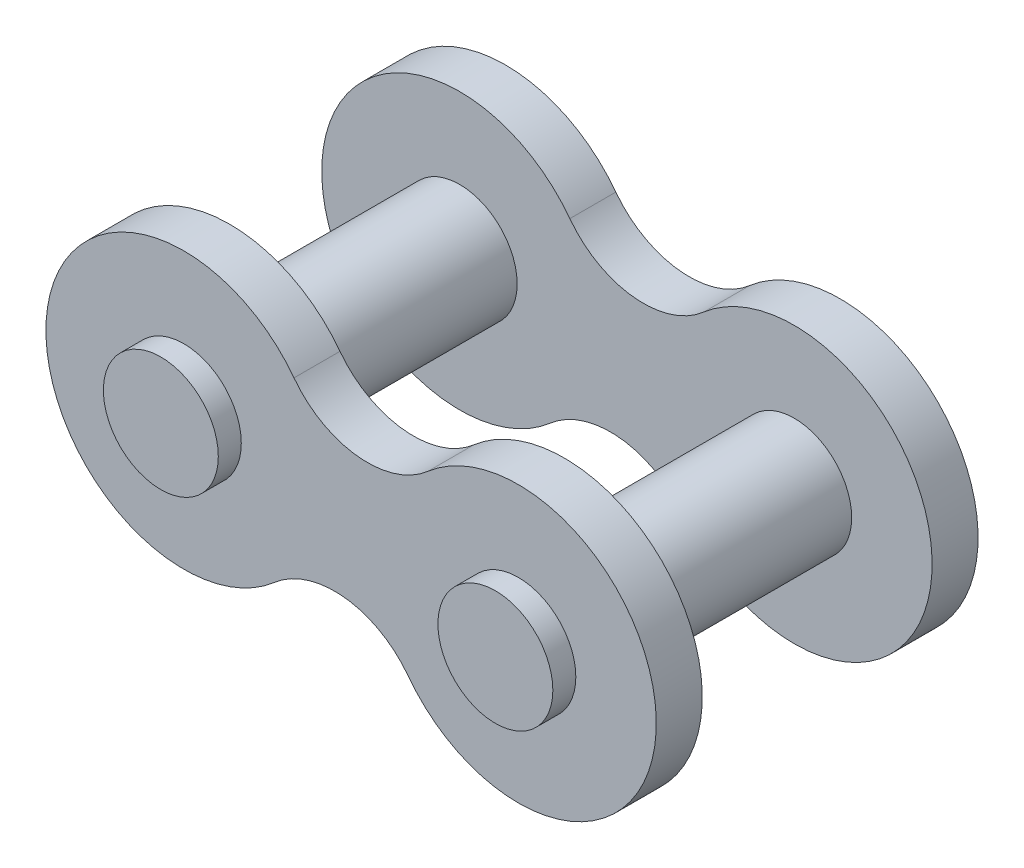
ISO-10303-21;
HEADER;
FILE_DESCRIPTION(('STEP AP214'),'2;1');
FILE_NAME('part.step','',(''),(''),'','','');
FILE_SCHEMA(('AUTOMOTIVE_DESIGN { 1 0 10303 214 1 1 1 1 }'));
ENDSEC;
DATA;
#1=APPLICATION_CONTEXT('core data for automotive mechanical design processes');
#2=APPLICATION_PROTOCOL_DEFINITION('international standard','automotive_design',2000,#1);
#3=PRODUCT_CONTEXT('',#1,'mechanical');
#4=PRODUCT('Part','Part','',(#3));
#5=PRODUCT_RELATED_PRODUCT_CATEGORY('part','',(#4));
#6=PRODUCT_DEFINITION_FORMATION('','',#4);
#7=PRODUCT_DEFINITION_CONTEXT('part definition',#1,'design');
#8=PRODUCT_DEFINITION('design','',#6,#7);
#9=PRODUCT_DEFINITION_SHAPE('','',#8);
#10=(LENGTH_UNIT() NAMED_UNIT(*) SI_UNIT(.MILLI.,.METRE.));
#11=(NAMED_UNIT(*) PLANE_ANGLE_UNIT() SI_UNIT($,.RADIAN.));
#12=(NAMED_UNIT(*) SI_UNIT($,.STERADIAN.) SOLID_ANGLE_UNIT());
#13=UNCERTAINTY_MEASURE_WITH_UNIT(LENGTH_MEASURE(1.E-05),#10,'distance_accuracy_value','');
#14=(GEOMETRIC_REPRESENTATION_CONTEXT(3) GLOBAL_UNCERTAINTY_ASSIGNED_CONTEXT((#13)) GLOBAL_UNIT_ASSIGNED_CONTEXT((#10,
#11,#12)) REPRESENTATION_CONTEXT('',''));
#15=CARTESIAN_POINT('',(0.,0.,0.));
#16=DIRECTION('',(0.,0.,1.));
#17=DIRECTION('',(1.,0.,0.));
#18=AXIS2_PLACEMENT_3D('',#15,#16,#17);
#19=CARTESIAN_POINT('',(14.5538183572432,68.4703320513664,3.));
#20=DIRECTION('',(0.,0.,-1.));
#21=DIRECTION('',(-1.,0.,0.));
#22=AXIS2_PLACEMENT_3D('',#19,#20,#21);
#23=CYLINDRICAL_SURFACE('',#22,2.5);
#24=CARTESIAN_POINT('',(14.5538183572432,68.4703320513664,3.));
#25=DIRECTION('',(0.,0.,1.));
#26=DIRECTION('',(1.,0.,0.));
#27=AXIS2_PLACEMENT_3D('',#24,#25,#26);
#28=CIRCLE('',#27,2.5);
#29=CARTESIAN_POINT('',(17.0538183572432,68.4703320513664,3.));
#30=VERTEX_POINT('',#29);
#31=EDGE_CURVE('E11',#30,#30,#28,.T.);
#32=ORIENTED_EDGE('',*,*,#31,.F.);
#33=EDGE_LOOP('',(#32));
#34=FACE_BOUND('',#33,.T.);
#35=CARTESIAN_POINT('',(14.5538183572432,68.4703320513664,-13.));
#36=DIRECTION('',(0.,0.,1.));
#37=DIRECTION('',(1.,0.,0.));
#38=AXIS2_PLACEMENT_3D('',#35,#36,#37);
#39=CIRCLE('',#38,2.5);
#40=CARTESIAN_POINT('',(17.0538183572432,68.4703320513664,-13.));
#41=VERTEX_POINT('',#40);
#42=EDGE_CURVE('E53',#41,#41,#39,.T.);
#43=ORIENTED_EDGE('',*,*,#42,.T.);
#44=EDGE_LOOP('',(#43));
#45=FACE_BOUND('',#44,.T.);
#46=ADVANCED_FACE('F50',(#34,#45),#23,.T.);
#47=CARTESIAN_POINT('',(0.,0.,3.));
#48=DIRECTION('',(0.,0.,1.));
#49=DIRECTION('',(1.,0.,0.));
#50=AXIS2_PLACEMENT_3D('',#47,#48,#49);
#51=PLANE('',#50);
#52=ORIENTED_EDGE('',*,*,#31,.T.);
#53=EDGE_LOOP('',(#52));
#54=FACE_BOUND('',#53,.T.);
#55=ADVANCED_FACE('F65',(#54),#51,.T.);
#56=CARTESIAN_POINT('',(0.,0.,-13.));
#57=DIRECTION('',(0.,0.,1.));
#58=DIRECTION('',(1.,0.,0.));
#59=AXIS2_PLACEMENT_3D('',#56,#57,#58);
#60=PLANE('',#59);
#61=ORIENTED_EDGE('',*,*,#42,.F.);
#62=EDGE_LOOP('',(#61));
#63=FACE_BOUND('',#62,.T.);
#64=ADVANCED_FACE('F63',(#63),#60,.F.);
#65=CLOSED_SHELL('',(#46,#55,#64));
#66=MANIFOLD_SOLID_BREP('B2',#65);
#67=CARTESIAN_POINT('',(0.,70.,3.));
#68=DIRECTION('',(0.,0.,-1.));
#69=DIRECTION('',(-1.,0.,0.));
#70=AXIS2_PLACEMENT_3D('',#67,#68,#69);
#71=CYLINDRICAL_SURFACE('',#70,2.50000000000001);
#72=CARTESIAN_POINT('',(0.,70.,3.));
#73=DIRECTION('',(0.,0.,1.));
#74=DIRECTION('',(1.,0.,0.));
#75=AXIS2_PLACEMENT_3D('',#72,#73,#74);
#76=CIRCLE('',#75,2.50000000000001);
#77=CARTESIAN_POINT('',(2.50000000000001,70.,3.));
#78=VERTEX_POINT('',#77);
#79=EDGE_CURVE('E49',#78,#78,#76,.T.);
#80=ORIENTED_EDGE('',*,*,#79,.F.);
#81=EDGE_LOOP('',(#80));
#82=FACE_BOUND('',#81,.T.);
#83=CARTESIAN_POINT('',(0.,70.,-13.));
#84=DIRECTION('',(0.,0.,1.));
#85=DIRECTION('',(1.,0.,0.));
#86=AXIS2_PLACEMENT_3D('',#83,#84,#85);
#87=CIRCLE('',#86,2.50000000000001);
#88=CARTESIAN_POINT('',(2.50000000000001,70.,-13.));
#89=VERTEX_POINT('',#88);
#90=EDGE_CURVE('E104',#89,#89,#87,.T.);
#91=ORIENTED_EDGE('',*,*,#90,.T.);
#92=EDGE_LOOP('',(#91));
#93=FACE_BOUND('',#92,.T.);
#94=ADVANCED_FACE('F101',(#82,#93),#71,.T.);
#95=CARTESIAN_POINT('',(0.,0.,3.));
#96=DIRECTION('',(0.,0.,1.));
#97=DIRECTION('',(1.,0.,0.));
#98=AXIS2_PLACEMENT_3D('',#95,#96,#97);
#99=PLANE('',#98);
#100=ORIENTED_EDGE('',*,*,#79,.T.);
#101=EDGE_LOOP('',(#100));
#102=FACE_BOUND('',#101,.T.);
#103=ADVANCED_FACE('F116',(#102),#99,.T.);
#104=CARTESIAN_POINT('',(0.,0.,-13.));
#105=DIRECTION('',(0.,0.,1.));
#106=DIRECTION('',(1.,0.,0.));
#107=AXIS2_PLACEMENT_3D('',#104,#105,#106);
#108=PLANE('',#107);
#109=ORIENTED_EDGE('',*,*,#90,.F.);
#110=EDGE_LOOP('',(#109));
#111=FACE_BOUND('',#110,.T.);
#112=ADVANCED_FACE('F114',(#111),#108,.F.);
#113=CLOSED_SHELL('',(#94,#103,#112));
#114=MANIFOLD_SOLID_BREP('B6',#113);
#115=CARTESIAN_POINT('',(6.56441429790983,62.4562300588235,-12.));
#116=DIRECTION('',(0.,0.,1.));
#117=DIRECTION('',(1.,0.,0.));
#118=AXIS2_PLACEMENT_3D('',#115,#116,#117);
#119=CYLINDRICAL_SURFACE('',#118,4.00000000000003);
#120=CARTESIAN_POINT('',(6.56441429790983,62.4562300588235,-10.));
#121=DIRECTION('',(0.,0.,-1.));
#122=DIRECTION('',(1.,0.,0.));
#123=AXIS2_PLACEMENT_3D('',#120,#121,#122);
#124=CIRCLE('',#123,4.00000000000003);
#125=CARTESIAN_POINT('',(3.93864857874589,65.4737380352941,-10.));
#126=VERTEX_POINT('',#125);
#127=CARTESIAN_POINT('',(9.76017592164318,64.8618708558406,-10.));
#128=VERTEX_POINT('',#127);
#129=EDGE_CURVE('E216',#126,#128,#124,.T.);
#130=ORIENTED_EDGE('',*,*,#129,.F.);
#131=DIRECTION('',(0.,0.,1.));
#132=VECTOR('',#131,1.);
#133=CARTESIAN_POINT('',(3.93864857874589,65.4737380352941,-12.));
#134=LINE('',#133,#132);
#135=CARTESIAN_POINT('',(3.93864857874589,65.4737380352941,-12.));
#136=VERTEX_POINT('',#135);
#137=EDGE_CURVE('E99',#136,#126,#134,.T.);
#138=ORIENTED_EDGE('',*,*,#137,.F.);
#139=CARTESIAN_POINT('',(6.56441429790983,62.4562300588235,-12.));
#140=DIRECTION('',(0.,0.,-1.));
#141=DIRECTION('',(1.,0.,0.));
#142=AXIS2_PLACEMENT_3D('',#139,#140,#141);
#143=CIRCLE('',#142,4.00000000000003);
#144=CARTESIAN_POINT('',(9.76017592164318,64.8618708558406,-12.));
#145=VERTEX_POINT('',#144);
#146=EDGE_CURVE('E209',#136,#145,#143,.T.);
#147=ORIENTED_EDGE('',*,*,#146,.T.);
#148=DIRECTION('',(0.,0.,1.));
#149=VECTOR('',#148,1.);
#150=CARTESIAN_POINT('',(9.76017592164318,64.8618708558406,-12.));
#151=LINE('',#150,#149);
#152=EDGE_CURVE('E154',#145,#128,#151,.T.);
#153=ORIENTED_EDGE('',*,*,#152,.T.);
#154=EDGE_LOOP('',(#130,#138,#147,#153));
#155=FACE_BOUND('',#154,.T.);
#156=ADVANCED_FACE('F151',(#155),#119,.F.);
#157=CARTESIAN_POINT('',(0.,70.,-12.));
#158=DIRECTION('',(0.,0.,1.));
#159=DIRECTION('',(1.,0.,0.));
#160=AXIS2_PLACEMENT_3D('',#157,#158,#159);
#161=CYLINDRICAL_SURFACE('',#160,6.00000000000003);
#162=CARTESIAN_POINT('',(0.,70.,-10.));
#163=DIRECTION('',(0.,0.,1.));
#164=DIRECTION('',(1.,0.,0.));
#165=AXIS2_PLACEMENT_3D('',#162,#163,#164);
#166=CIRCLE('',#165,6.00000000000003);
#167=CARTESIAN_POINT('',(4.79364243560004,73.6084611955257,-10.));
#168=VERTEX_POINT('',#167);
#169=EDGE_CURVE('E211',#168,#126,#166,.T.);
#170=ORIENTED_EDGE('',*,*,#169,.F.);
#171=DIRECTION('',(0.,0.,1.));
#172=VECTOR('',#171,1.);
#173=CARTESIAN_POINT('',(4.79364243560004,73.6084611955257,-12.));
#174=LINE('',#173,#172);
#175=CARTESIAN_POINT('',(4.79364243560004,73.6084611955257,-12.));
#176=VERTEX_POINT('',#175);
#177=EDGE_CURVE('E160',#176,#168,#174,.T.);
#178=ORIENTED_EDGE('',*,*,#177,.F.);
#179=CARTESIAN_POINT('',(0.,70.,-12.));
#180=DIRECTION('',(0.,0.,1.));
#181=DIRECTION('',(1.,0.,0.));
#182=AXIS2_PLACEMENT_3D('',#179,#180,#181);
#183=CIRCLE('',#182,6.00000000000003);
#184=EDGE_CURVE('E206',#176,#136,#183,.T.);
#185=ORIENTED_EDGE('',*,*,#184,.T.);
#186=ORIENTED_EDGE('',*,*,#137,.T.);
#187=EDGE_LOOP('',(#170,#178,#185,#186));
#188=FACE_BOUND('',#187,.T.);
#189=ADVANCED_FACE('F227',(#188),#161,.T.);
#190=CARTESIAN_POINT('',(7.98940405933339,76.0141019925429,-12.));
#191=DIRECTION('',(0.,0.,1.));
#192=DIRECTION('',(1.,0.,0.));
#193=AXIS2_PLACEMENT_3D('',#190,#191,#192);
#194=CYLINDRICAL_SURFACE('',#193,4.00000000000003);
#195=CARTESIAN_POINT('',(7.98940405933339,76.0141019925429,-10.));
#196=DIRECTION('',(0.,0.,-1.));
#197=DIRECTION('',(-1.,0.,0.));
#198=AXIS2_PLACEMENT_3D('',#195,#196,#197);
#199=CIRCLE('',#198,4.00000000000003);
#200=CARTESIAN_POINT('',(10.6151697784973,72.9965940160723,-10.));
#201=VERTEX_POINT('',#200);
#202=EDGE_CURVE('E201',#201,#168,#199,.T.);
#203=ORIENTED_EDGE('',*,*,#202,.F.);
#204=DIRECTION('',(0.,0.,1.));
#205=VECTOR('',#204,1.);
#206=CARTESIAN_POINT('',(10.6151697784973,72.9965940160723,-12.));
#207=LINE('',#206,#205);
#208=CARTESIAN_POINT('',(10.6151697784973,72.9965940160723,-12.));
#209=VERTEX_POINT('',#208);
#210=EDGE_CURVE('E196',#209,#201,#207,.T.);
#211=ORIENTED_EDGE('',*,*,#210,.F.);
#212=CARTESIAN_POINT('',(7.98940405933339,76.0141019925429,-12.));
#213=DIRECTION('',(0.,0.,-1.));
#214=DIRECTION('',(-1.,0.,0.));
#215=AXIS2_PLACEMENT_3D('',#212,#213,#214);
#216=CIRCLE('',#215,4.00000000000003);
#217=EDGE_CURVE('E199',#209,#176,#216,.T.);
#218=ORIENTED_EDGE('',*,*,#217,.T.);
#219=ORIENTED_EDGE('',*,*,#177,.T.);
#220=EDGE_LOOP('',(#203,#211,#218,#219));
#221=FACE_BOUND('',#220,.T.);
#222=ADVANCED_FACE('F198',(#221),#194,.F.);
#223=CARTESIAN_POINT('',(14.5538183572432,68.4703320513664,-12.));
#224=DIRECTION('',(0.,0.,1.));
#225=DIRECTION('',(1.,0.,0.));
#226=AXIS2_PLACEMENT_3D('',#223,#224,#225);
#227=CYLINDRICAL_SURFACE('',#226,6.00000000000004);
#228=CARTESIAN_POINT('',(14.5538183572432,68.4703320513664,-10.));
#229=DIRECTION('',(0.,0.,1.));
#230=DIRECTION('',(1.,0.,0.));
#231=AXIS2_PLACEMENT_3D('',#228,#229,#230);
#232=CIRCLE('',#231,6.00000000000004);
#233=EDGE_CURVE('E219',#128,#201,#232,.T.);
#234=ORIENTED_EDGE('',*,*,#233,.F.);
#235=ORIENTED_EDGE('',*,*,#152,.F.);
#236=CARTESIAN_POINT('',(14.5538183572432,68.4703320513664,-12.));
#237=DIRECTION('',(0.,0.,1.));
#238=DIRECTION('',(1.,0.,0.));
#239=AXIS2_PLACEMENT_3D('',#236,#237,#238);
#240=CIRCLE('',#239,6.00000000000004);
#241=EDGE_CURVE('E205',#145,#209,#240,.T.);
#242=ORIENTED_EDGE('',*,*,#241,.T.);
#243=ORIENTED_EDGE('',*,*,#210,.T.);
#244=EDGE_LOOP('',(#234,#235,#242,#243));
#245=FACE_BOUND('',#244,.T.);
#246=ADVANCED_FACE('F208',(#245),#227,.T.);
#247=CARTESIAN_POINT('',(3.28220714895491,66.2281150294117,-12.));
#248=DIRECTION('',(0.,0.,1.));
#249=DIRECTION('',(1.,0.,0.));
#250=AXIS2_PLACEMENT_3D('',#247,#248,#249);
#251=PLANE('',#250);
#252=CARTESIAN_POINT('',(14.5538183572432,68.4703320513664,-12.));
#253=DIRECTION('',(0.,0.,1.));
#254=DIRECTION('',(1.,0.,0.));
#255=AXIS2_PLACEMENT_3D('',#252,#253,#254);
#256=CIRCLE('',#255,2.5);
#257=CARTESIAN_POINT('',(17.0538183572432,68.4703320513664,-12.));
#258=VERTEX_POINT('',#257);
#259=EDGE_CURVE('E260',#258,#258,#256,.T.);
#260=ORIENTED_EDGE('',*,*,#259,.T.);
#261=EDGE_LOOP('',(#260));
#262=FACE_BOUND('',#261,.T.);
#263=CARTESIAN_POINT('',(0.,70.,-12.));
#264=DIRECTION('',(0.,0.,1.));
#265=DIRECTION('',(1.,0.,0.));
#266=AXIS2_PLACEMENT_3D('',#263,#264,#265);
#267=CIRCLE('',#266,2.50000000000001);
#268=CARTESIAN_POINT('',(2.50000000000001,70.,-12.));
#269=VERTEX_POINT('',#268);
#270=EDGE_CURVE('E220',#269,#269,#267,.T.);
#271=ORIENTED_EDGE('',*,*,#270,.T.);
#272=EDGE_LOOP('',(#271));
#273=FACE_BOUND('',#272,.T.);
#274=ORIENTED_EDGE('',*,*,#146,.F.);
#275=ORIENTED_EDGE('',*,*,#184,.F.);
#276=ORIENTED_EDGE('',*,*,#217,.F.);
#277=ORIENTED_EDGE('',*,*,#241,.F.);
#278=EDGE_LOOP('',(#274,#275,#276,#277));
#279=FACE_BOUND('',#278,.T.);
#280=ADVANCED_FACE('F204',(#262,#273,#279),#251,.F.);
#281=CARTESIAN_POINT('',(3.28220714895491,66.2281150294117,-10.));
#282=DIRECTION('',(0.,0.,1.));
#283=DIRECTION('',(1.,0.,0.));
#284=AXIS2_PLACEMENT_3D('',#281,#282,#283);
#285=PLANE('',#284);
#286=CARTESIAN_POINT('',(14.5538183572432,68.4703320513664,-10.));
#287=DIRECTION('',(0.,0.,1.));
#288=DIRECTION('',(1.,0.,0.));
#289=AXIS2_PLACEMENT_3D('',#286,#287,#288);
#290=CIRCLE('',#289,2.5);
#291=CARTESIAN_POINT('',(17.0538183572432,68.4703320513664,-10.));
#292=VERTEX_POINT('',#291);
#293=EDGE_CURVE('E263',#292,#292,#290,.T.);
#294=ORIENTED_EDGE('',*,*,#293,.F.);
#295=EDGE_LOOP('',(#294));
#296=FACE_BOUND('',#295,.T.);
#297=CARTESIAN_POINT('',(0.,70.,-10.));
#298=DIRECTION('',(0.,0.,1.));
#299=DIRECTION('',(1.,0.,0.));
#300=AXIS2_PLACEMENT_3D('',#297,#298,#299);
#301=CIRCLE('',#300,2.50000000000001);
#302=CARTESIAN_POINT('',(2.50000000000001,70.,-10.));
#303=VERTEX_POINT('',#302);
#304=EDGE_CURVE('E265',#303,#303,#301,.T.);
#305=ORIENTED_EDGE('',*,*,#304,.F.);
#306=EDGE_LOOP('',(#305));
#307=FACE_BOUND('',#306,.T.);
#308=ORIENTED_EDGE('',*,*,#129,.T.);
#309=ORIENTED_EDGE('',*,*,#233,.T.);
#310=ORIENTED_EDGE('',*,*,#202,.T.);
#311=ORIENTED_EDGE('',*,*,#169,.T.);
#312=EDGE_LOOP('',(#308,#309,#310,#311));
#313=FACE_BOUND('',#312,.T.);
#314=ADVANCED_FACE('F226',(#296,#307,#313),#285,.T.);
#315=CARTESIAN_POINT('',(0.,70.,-12.));
#316=DIRECTION('',(0.,0.,1.));
#317=DIRECTION('',(1.,0.,0.));
#318=AXIS2_PLACEMENT_3D('',#315,#316,#317);
#319=CYLINDRICAL_SURFACE('',#318,2.50000000000001);
#320=ORIENTED_EDGE('',*,*,#270,.F.);
#321=EDGE_LOOP('',(#320));
#322=FACE_BOUND('',#321,.T.);
#323=ORIENTED_EDGE('',*,*,#304,.T.);
#324=EDGE_LOOP('',(#323));
#325=FACE_BOUND('',#324,.T.);
#326=ADVANCED_FACE('F245',(#322,#325),#319,.F.);
#327=CARTESIAN_POINT('',(14.5538183572432,68.4703320513664,-12.));
#328=DIRECTION('',(0.,0.,1.));
#329=DIRECTION('',(1.,0.,0.));
#330=AXIS2_PLACEMENT_3D('',#327,#328,#329);
#331=CYLINDRICAL_SURFACE('',#330,2.5);
#332=ORIENTED_EDGE('',*,*,#259,.F.);
#333=EDGE_LOOP('',(#332));
#334=FACE_BOUND('',#333,.T.);
#335=ORIENTED_EDGE('',*,*,#293,.T.);
#336=EDGE_LOOP('',(#335));
#337=FACE_BOUND('',#336,.T.);
#338=ADVANCED_FACE('F252',(#334,#337),#331,.F.);
#339=CLOSED_SHELL('',(#156,#189,#222,#246,#280,#314,#326,#338));
#340=MANIFOLD_SOLID_BREP('B44',#339);
#341=CARTESIAN_POINT('',(3.28220714895491,66.2281150294117,2.));
#342=DIRECTION('',(0.,0.,1.));
#343=DIRECTION('',(1.,0.,0.));
#344=AXIS2_PLACEMENT_3D('',#341,#342,#343);
#345=PLANE('',#344);
#346=CARTESIAN_POINT('',(0.,70.,2.));
#347=DIRECTION('',(0.,0.,1.));
#348=DIRECTION('',(1.,0.,0.));
#349=AXIS2_PLACEMENT_3D('',#346,#347,#348);
#350=CIRCLE('',#349,2.50000000000001);
#351=CARTESIAN_POINT('',(2.50000000000001,70.,2.));
#352=VERTEX_POINT('',#351);
#353=EDGE_CURVE('E384',#352,#352,#350,.T.);
#354=ORIENTED_EDGE('',*,*,#353,.F.);
#355=EDGE_LOOP('',(#354));
#356=FACE_BOUND('',#355,.T.);
#357=CARTESIAN_POINT('',(6.56441429790983,62.4562300588235,2.));
#358=DIRECTION('',(0.,0.,-1.));
#359=DIRECTION('',(1.,0.,0.));
#360=AXIS2_PLACEMENT_3D('',#357,#358,#359);
#361=CIRCLE('',#360,4.00000000000003);
#362=CARTESIAN_POINT('',(3.93864857874589,65.4737380352941,2.));
#363=VERTEX_POINT('',#362);
#364=CARTESIAN_POINT('',(9.76017592164318,64.8618708558406,2.));
#365=VERTEX_POINT('',#364);
#366=EDGE_CURVE('E369',#363,#365,#361,.T.);
#367=ORIENTED_EDGE('',*,*,#366,.T.);
#368=CARTESIAN_POINT('',(14.5538183572432,68.4703320513664,2.));
#369=DIRECTION('',(0.,0.,1.));
#370=DIRECTION('',(1.,0.,0.));
#371=AXIS2_PLACEMENT_3D('',#368,#369,#370);
#372=CIRCLE('',#371,6.00000000000004);
#373=CARTESIAN_POINT('',(10.6151697784973,72.9965940160723,2.));
#374=VERTEX_POINT('',#373);
#375=EDGE_CURVE('E364',#365,#374,#372,.T.);
#376=ORIENTED_EDGE('',*,*,#375,.T.);
#377=CARTESIAN_POINT('',(7.98940405933339,76.0141019925429,2.));
#378=DIRECTION('',(0.,0.,-1.));
#379=DIRECTION('',(-1.,0.,0.));
#380=AXIS2_PLACEMENT_3D('',#377,#378,#379);
#381=CIRCLE('',#380,4.00000000000003);
#382=CARTESIAN_POINT('',(4.79364243560004,73.6084611955257,2.));
#383=VERTEX_POINT('',#382);
#384=EDGE_CURVE('E367',#374,#383,#381,.T.);
#385=ORIENTED_EDGE('',*,*,#384,.T.);
#386=CARTESIAN_POINT('',(0.,70.,2.));
#387=DIRECTION('',(0.,0.,1.));
#388=DIRECTION('',(1.,0.,0.));
#389=AXIS2_PLACEMENT_3D('',#386,#387,#388);
#390=CIRCLE('',#389,6.00000000000003);
#391=EDGE_CURVE('E334',#383,#363,#390,.T.);
#392=ORIENTED_EDGE('',*,*,#391,.T.);
#393=EDGE_LOOP('',(#367,#376,#385,#392));
#394=FACE_BOUND('',#393,.T.);
#395=CARTESIAN_POINT('',(14.5538183572432,68.4703320513664,2.));
#396=DIRECTION('',(0.,0.,1.));
#397=DIRECTION('',(1.,0.,0.));
#398=AXIS2_PLACEMENT_3D('',#395,#396,#397);
#399=CIRCLE('',#398,2.5);
#400=CARTESIAN_POINT('',(17.0538183572432,68.4703320513664,2.));
#401=VERTEX_POINT('',#400);
#402=EDGE_CURVE('E399',#401,#401,#399,.T.);
#403=ORIENTED_EDGE('',*,*,#402,.F.);
#404=EDGE_LOOP('',(#403));
#405=FACE_BOUND('',#404,.T.);
#406=ADVANCED_FACE('F317',(#356,#394,#405),#345,.T.);
#407=CARTESIAN_POINT('',(3.28220714895491,66.2281150294117,0.));
#408=DIRECTION('',(0.,0.,1.));
#409=DIRECTION('',(1.,0.,0.));
#410=AXIS2_PLACEMENT_3D('',#407,#408,#409);
#411=PLANE('',#410);
#412=CARTESIAN_POINT('',(6.56441429790983,62.4562300588235,0.));
#413=DIRECTION('',(0.,0.,-1.));
#414=DIRECTION('',(1.,0.,0.));
#415=AXIS2_PLACEMENT_3D('',#412,#413,#414);
#416=CIRCLE('',#415,4.00000000000003);
#417=CARTESIAN_POINT('',(3.93864857874589,65.4737380352941,0.));
#418=VERTEX_POINT('',#417);
#419=CARTESIAN_POINT('',(9.76017592164318,64.8618708558406,0.));
#420=VERTEX_POINT('',#419);
#421=EDGE_CURVE('E381',#418,#420,#416,.T.);
#422=ORIENTED_EDGE('',*,*,#421,.F.);
#423=CARTESIAN_POINT('',(0.,70.,0.));
#424=DIRECTION('',(0.,0.,1.));
#425=DIRECTION('',(1.,0.,0.));
#426=AXIS2_PLACEMENT_3D('',#423,#424,#425);
#427=CIRCLE('',#426,6.00000000000003);
#428=CARTESIAN_POINT('',(4.79364243560004,73.6084611955257,0.));
#429=VERTEX_POINT('',#428);
#430=EDGE_CURVE('E357',#429,#418,#427,.T.);
#431=ORIENTED_EDGE('',*,*,#430,.F.);
#432=CARTESIAN_POINT('',(7.98940405933339,76.0141019925429,0.));
#433=DIRECTION('',(0.,0.,-1.));
#434=DIRECTION('',(-1.,0.,0.));
#435=AXIS2_PLACEMENT_3D('',#432,#433,#434);
#436=CIRCLE('',#435,4.00000000000003);
#437=CARTESIAN_POINT('',(10.6151697784973,72.9965940160723,0.));
#438=VERTEX_POINT('',#437);
#439=EDGE_CURVE('E351',#438,#429,#436,.T.);
#440=ORIENTED_EDGE('',*,*,#439,.F.);
#441=CARTESIAN_POINT('',(14.5538183572432,68.4703320513664,0.));
#442=DIRECTION('',(0.,0.,1.));
#443=DIRECTION('',(1.,0.,0.));
#444=AXIS2_PLACEMENT_3D('',#441,#442,#443);
#445=CIRCLE('',#444,6.00000000000004);
#446=EDGE_CURVE('E373',#420,#438,#445,.T.);
#447=ORIENTED_EDGE('',*,*,#446,.F.);
#448=EDGE_LOOP('',(#422,#431,#440,#447));
#449=FACE_BOUND('',#448,.T.);
#450=CARTESIAN_POINT('',(0.,70.,0.));
#451=DIRECTION('',(0.,0.,1.));
#452=DIRECTION('',(1.,0.,0.));
#453=AXIS2_PLACEMENT_3D('',#450,#451,#452);
#454=CIRCLE('',#453,2.50000000000001);
#455=CARTESIAN_POINT('',(2.50000000000001,70.,0.));
#456=VERTEX_POINT('',#455);
#457=EDGE_CURVE('E396',#456,#456,#454,.T.);
#458=ORIENTED_EDGE('',*,*,#457,.T.);
#459=EDGE_LOOP('',(#458));
#460=FACE_BOUND('',#459,.T.);
#461=CARTESIAN_POINT('',(14.5538183572432,68.4703320513664,0.));
#462=DIRECTION('',(0.,0.,1.));
#463=DIRECTION('',(1.,0.,0.));
#464=AXIS2_PLACEMENT_3D('',#461,#462,#463);
#465=CIRCLE('',#464,2.5);
#466=CARTESIAN_POINT('',(17.0538183572432,68.4703320513664,0.));
#467=VERTEX_POINT('',#466);
#468=EDGE_CURVE('E402',#467,#467,#465,.T.);
#469=ORIENTED_EDGE('',*,*,#468,.T.);
#470=EDGE_LOOP('',(#469));
#471=FACE_BOUND('',#470,.T.);
#472=ADVANCED_FACE('F392',(#449,#460,#471),#411,.F.);
#473=CARTESIAN_POINT('',(6.56441429790983,62.4562300588235,2.));
#474=DIRECTION('',(0.,0.,-1.));
#475=DIRECTION('',(-1.,0.,0.));
#476=AXIS2_PLACEMENT_3D('',#473,#474,#475);
#477=CYLINDRICAL_SURFACE('',#476,4.00000000000003);
#478=ORIENTED_EDGE('',*,*,#421,.T.);
#479=DIRECTION('',(0.,0.,-1.));
#480=VECTOR('',#479,1.);
#481=CARTESIAN_POINT('',(9.76017592164318,64.8618708558406,2.));
#482=LINE('',#481,#480);
#483=EDGE_CURVE('E149',#365,#420,#482,.T.);
#484=ORIENTED_EDGE('',*,*,#483,.F.);
#485=ORIENTED_EDGE('',*,*,#366,.F.);
#486=DIRECTION('',(0.,0.,-1.));
#487=VECTOR('',#486,1.);
#488=CARTESIAN_POINT('',(3.93864857874589,65.4737380352941,2.));
#489=LINE('',#488,#487);
#490=EDGE_CURVE('E377',#363,#418,#489,.T.);
#491=ORIENTED_EDGE('',*,*,#490,.T.);
#492=EDGE_LOOP('',(#478,#484,#485,#491));
#493=FACE_BOUND('',#492,.T.);
#494=ADVANCED_FACE('F319',(#493),#477,.F.);
#495=CARTESIAN_POINT('',(14.5538183572432,68.4703320513664,2.));
#496=DIRECTION('',(0.,0.,-1.));
#497=DIRECTION('',(-1.,0.,0.));
#498=AXIS2_PLACEMENT_3D('',#495,#496,#497);
#499=CYLINDRICAL_SURFACE('',#498,6.00000000000004);
#500=ORIENTED_EDGE('',*,*,#446,.T.);
#501=DIRECTION('',(0.,0.,-1.));
#502=VECTOR('',#501,1.);
#503=CARTESIAN_POINT('',(10.6151697784973,72.9965940160723,2.));
#504=LINE('',#503,#502);
#505=EDGE_CURVE('E326',#374,#438,#504,.T.);
#506=ORIENTED_EDGE('',*,*,#505,.F.);
#507=ORIENTED_EDGE('',*,*,#375,.F.);
#508=ORIENTED_EDGE('',*,*,#483,.T.);
#509=EDGE_LOOP('',(#500,#506,#507,#508));
#510=FACE_BOUND('',#509,.T.);
#511=ADVANCED_FACE('F372',(#510),#499,.T.);
#512=CARTESIAN_POINT('',(7.98940405933339,76.0141019925429,2.));
#513=DIRECTION('',(0.,0.,-1.));
#514=DIRECTION('',(-1.,0.,0.));
#515=AXIS2_PLACEMENT_3D('',#512,#513,#514);
#516=CYLINDRICAL_SURFACE('',#515,4.00000000000003);
#517=ORIENTED_EDGE('',*,*,#439,.T.);
#518=DIRECTION('',(0.,0.,-1.));
#519=VECTOR('',#518,1.);
#520=CARTESIAN_POINT('',(4.79364243560004,73.6084611955257,2.));
#521=LINE('',#520,#519);
#522=EDGE_CURVE('E374',#383,#429,#521,.T.);
#523=ORIENTED_EDGE('',*,*,#522,.F.);
#524=ORIENTED_EDGE('',*,*,#384,.F.);
#525=ORIENTED_EDGE('',*,*,#505,.T.);
#526=EDGE_LOOP('',(#517,#523,#524,#525));
#527=FACE_BOUND('',#526,.T.);
#528=ADVANCED_FACE('F375',(#527),#516,.F.);
#529=CARTESIAN_POINT('',(0.,70.,2.));
#530=DIRECTION('',(0.,0.,-1.));
#531=DIRECTION('',(-1.,0.,0.));
#532=AXIS2_PLACEMENT_3D('',#529,#530,#531);
#533=CYLINDRICAL_SURFACE('',#532,6.00000000000003);
#534=ORIENTED_EDGE('',*,*,#430,.T.);
#535=ORIENTED_EDGE('',*,*,#490,.F.);
#536=ORIENTED_EDGE('',*,*,#391,.F.);
#537=ORIENTED_EDGE('',*,*,#522,.T.);
#538=EDGE_LOOP('',(#534,#535,#536,#537));
#539=FACE_BOUND('',#538,.T.);
#540=ADVANCED_FACE('F389',(#539),#533,.T.);
#541=CARTESIAN_POINT('',(0.,70.,2.));
#542=DIRECTION('',(0.,0.,-1.));
#543=DIRECTION('',(-1.,0.,0.));
#544=AXIS2_PLACEMENT_3D('',#541,#542,#543);
#545=CYLINDRICAL_SURFACE('',#544,2.50000000000001);
#546=ORIENTED_EDGE('',*,*,#353,.T.);
#547=EDGE_LOOP('',(#546));
#548=FACE_BOUND('',#547,.T.);
#549=ORIENTED_EDGE('',*,*,#457,.F.);
#550=EDGE_LOOP('',(#549));
#551=FACE_BOUND('',#550,.T.);
#552=ADVANCED_FACE('F419',(#548,#551),#545,.F.);
#553=CARTESIAN_POINT('',(14.5538183572432,68.4703320513664,2.));
#554=DIRECTION('',(0.,0.,-1.));
#555=DIRECTION('',(-1.,0.,0.));
#556=AXIS2_PLACEMENT_3D('',#553,#554,#555);
#557=CYLINDRICAL_SURFACE('',#556,2.5);
#558=ORIENTED_EDGE('',*,*,#402,.T.);
#559=EDGE_LOOP('',(#558));
#560=FACE_BOUND('',#559,.T.);
#561=ORIENTED_EDGE('',*,*,#468,.F.);
#562=EDGE_LOOP('',(#561));
#563=FACE_BOUND('',#562,.T.);
#564=ADVANCED_FACE('F408',(#560,#563),#557,.F.);
#565=CLOSED_SHELL('',(#406,#472,#494,#511,#528,#540,#552,#564));
#566=MANIFOLD_SOLID_BREP('B93',#565);
#567=ADVANCED_BREP_SHAPE_REPRESENTATION('',(#18,#66,#114,#340,#566),#14);
#568=SHAPE_DEFINITION_REPRESENTATION(#9,#567);
ENDSEC;
END-ISO-10303-21;
